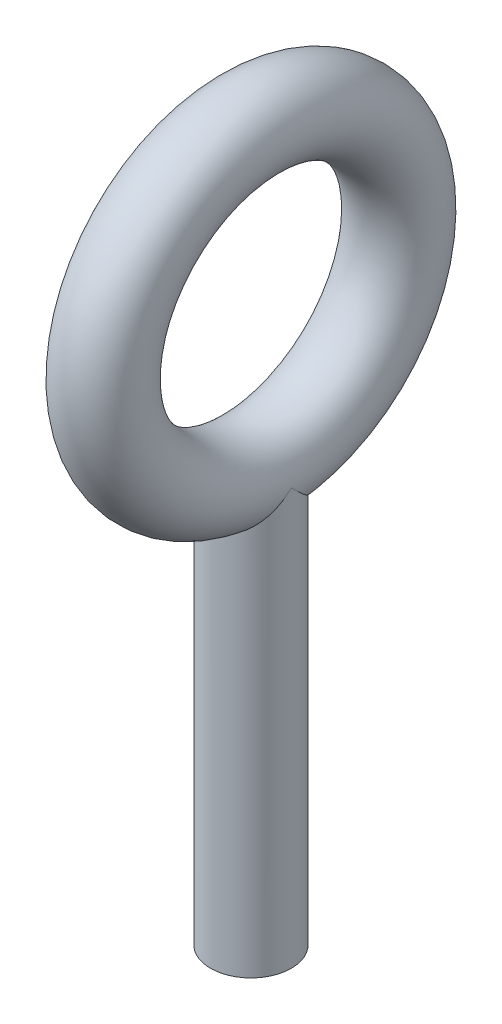
ISO-10303-21;
HEADER;
FILE_DESCRIPTION(('STEP AP214'),'2;1');
FILE_NAME('part.step','',(''),(''),'','','');
FILE_SCHEMA(('AUTOMOTIVE_DESIGN { 1 0 10303 214 1 1 1 1 }'));
ENDSEC;
DATA;
#1=APPLICATION_CONTEXT('core data for automotive mechanical design processes');
#2=APPLICATION_PROTOCOL_DEFINITION('international standard','automotive_design',2000,#1);
#3=PRODUCT_CONTEXT('',#1,'mechanical');
#4=PRODUCT('Part','Part','',(#3));
#5=PRODUCT_RELATED_PRODUCT_CATEGORY('part','',(#4));
#6=PRODUCT_DEFINITION_FORMATION('','',#4);
#7=PRODUCT_DEFINITION_CONTEXT('part definition',#1,'design');
#8=PRODUCT_DEFINITION('design','',#6,#7);
#9=PRODUCT_DEFINITION_SHAPE('','',#8);
#10=(LENGTH_UNIT() NAMED_UNIT(*) SI_UNIT(.MILLI.,.METRE.));
#11=(NAMED_UNIT(*) PLANE_ANGLE_UNIT() SI_UNIT($,.RADIAN.));
#12=(NAMED_UNIT(*) SI_UNIT($,.STERADIAN.) SOLID_ANGLE_UNIT());
#13=UNCERTAINTY_MEASURE_WITH_UNIT(LENGTH_MEASURE(1.E-05),#10,'distance_accuracy_value','');
#14=(GEOMETRIC_REPRESENTATION_CONTEXT(3) GLOBAL_UNCERTAINTY_ASSIGNED_CONTEXT((#13)) GLOBAL_UNIT_ASSIGNED_CONTEXT((#10,
#11,#12)) REPRESENTATION_CONTEXT('',''));
#15=CARTESIAN_POINT('',(0.,0.,0.));
#16=DIRECTION('',(0.,0.,1.));
#17=DIRECTION('',(1.,0.,0.));
#18=AXIS2_PLACEMENT_3D('',#15,#16,#17);
#19=CARTESIAN_POINT('',(0.,-6.1468,0.));
#20=DIRECTION('',(0.,1.,0.));
#21=DIRECTION('',(-1.,0.,0.));
#22=AXIS2_PLACEMENT_3D('',#19,#20,#21);
#23=PLANE('',#22);
#24=CARTESIAN_POINT('',(0.,-6.1468,0.));
#25=DIRECTION('',(0.,1.,0.));
#26=DIRECTION('',(-1.,0.,0.));
#27=AXIS2_PLACEMENT_3D('',#24,#25,#26);
#28=CIRCLE('',#27,0.5969);
#29=CARTESIAN_POINT('',(-0.596899999999999,-6.1468,0.));
#30=VERTEX_POINT('',#29);
#31=EDGE_CURVE('E58',#30,#30,#28,.T.);
#32=ORIENTED_EDGE('',*,*,#31,.F.);
#33=EDGE_LOOP('',(#32));
#34=FACE_BOUND('',#33,.T.);
#35=ADVANCED_FACE('F36',(#34),#23,.F.);
#36=CARTESIAN_POINT('',(0.,0.,0.));
#37=DIRECTION('',(0.,1.,0.));
#38=DIRECTION('',(-1.,0.,0.));
#39=AXIS2_PLACEMENT_3D('',#36,#37,#38);
#40=CYLINDRICAL_SURFACE('',#39,0.5969);
#41=ORIENTED_EDGE('',*,*,#31,.T.);
#42=EDGE_LOOP('',(#41));
#43=FACE_BOUND('',#42,.T.);
#44=CARTESIAN_POINT('',(-0.596900000000008,0.,0.));
#45=CARTESIAN_POINT('',(-0.59689999672191,-0.00115166970639385,-0.00115166395822712));
#46=CARTESIAN_POINT('',(-0.596896663850171,-0.00230293210871517,-0.00230383750789253));
#47=CARTESIAN_POINT('',(-0.596683975074274,-0.0389902069788766,-0.0390492907996926));
#48=CARTESIAN_POINT('',(-0.593294296523942,-0.0741274953254708,-0.0751142793313067));
#49=CARTESIAN_POINT('',(-0.579584038373088,-0.142996451439127,-0.147405062306423));
#50=CARTESIAN_POINT('',(-0.569251658724919,-0.176725622084085,-0.183631026042319));
#51=CARTESIAN_POINT('',(-0.542629910612611,-0.238196290566407,-0.250992645636391));
#52=CARTESIAN_POINT('',(-0.52716990452444,-0.266178648269077,-0.282231590514672));
#53=CARTESIAN_POINT('',(-0.489850016558436,-0.319699822107093,-0.34293153130478));
#54=CARTESIAN_POINT('',(-0.467999843013148,-0.345242267579701,-0.372395143112474));
#55=CARTESIAN_POINT('',(-0.422967037142856,-0.387859170793755,-0.422212059964091));
#56=CARTESIAN_POINT('',(-0.401063884762186,-0.40557748576254,-0.443167716610892));
#57=CARTESIAN_POINT('',(-0.353100226478506,-0.43833093396657,-0.48224837340783));
#58=CARTESIAN_POINT('',(-0.327044413154196,-0.453369055712043,-0.500376523474592));
#59=CARTESIAN_POINT('',(-0.275758103179163,-0.477834094144657,-0.530068366450765));
#60=CARTESIAN_POINT('',(-0.25111843235949,-0.487778830974002,-0.542222874781559));
#61=CARTESIAN_POINT('',(-0.199563337685278,-0.504903324176813,-0.563238288474522));
#62=CARTESIAN_POINT('',(-0.172648955762118,-0.512084338191715,-0.572100691856146));
#63=CARTESIAN_POINT('',(-0.117054366971276,-0.523332478977347,-0.586014346634592));
#64=CARTESIAN_POINT('',(-0.0883654858306846,-0.527382746382812,-0.591044961400426));
#65=CARTESIAN_POINT('',(-0.0302854841852904,-0.532050188002906,-0.596844085703701));
#66=CARTESIAN_POINT('',(-0.000894642224942459,-0.532668701963456,-0.597614258504143));
#67=CARTESIAN_POINT('',(0.0548076303898074,-0.53054237850848,-0.594970756146327));
#68=CARTESIAN_POINT('',(0.0811505878990104,-0.528105874154994,-0.591940625835263));
#69=CARTESIAN_POINT('',(0.132818571562041,-0.520514831812041,-0.582527610778966));
#70=CARTESIAN_POINT('',(0.158143596866914,-0.515360291555784,-0.576144723237598));
#71=CARTESIAN_POINT('',(0.207506606196205,-0.502492465874494,-0.560278836043188));
#72=CARTESIAN_POINT('',(0.231522373486923,-0.49474529958647,-0.550754812715354));
#73=CARTESIAN_POINT('',(0.277460170251825,-0.477034110025979,-0.529104071902027));
#74=CARTESIAN_POINT('',(0.299381558002946,-0.467069410389621,-0.51697656037355));
#75=CARTESIAN_POINT('',(0.343528231705452,-0.443862500951751,-0.488923664721468));
#76=CARTESIAN_POINT('',(0.365435284639527,-0.430364310979961,-0.472711117113507));
#77=CARTESIAN_POINT('',(0.406124999135573,-0.401416594123904,-0.43825165407306));
#78=CARTESIAN_POINT('',(0.42490541315061,-0.385965677460319,-0.420003290821415));
#79=CARTESIAN_POINT('',(0.468174189097679,-0.345163764794427,-0.372296644811044));
#80=CARTESIAN_POINT('',(0.490659727748239,-0.318795221667218,-0.341883754321856));
#81=CARTESIAN_POINT('',(0.528864325309235,-0.263473679698126,-0.279187227434826));
#82=CARTESIAN_POINT('',(0.544568075898522,-0.234515010126415,-0.246899543421829));
#83=CARTESIAN_POINT('',(0.570563921531062,-0.172705185450035,-0.179298854105692));
#84=CARTESIAN_POINT('',(0.580399017763528,-0.139723480827757,-0.143932529247574));
#85=CARTESIAN_POINT('',(0.593455159625093,-0.0724376676477142,-0.0733801876493672));
#86=CARTESIAN_POINT('',(0.596688918821215,-0.0381362308950352,-0.0381939547501493));
#87=CARTESIAN_POINT('',(0.596896664078754,-0.0023029330153976,-0.00230383860594077));
#88=CARTESIAN_POINT('',(0.596899996965183,-0.0011516706078514,-0.00115166505575185));
#89=CARTESIAN_POINT('',(0.596900000000008,0.,0.));
#90=B_SPLINE_CURVE_WITH_KNOTS('',3,(#44,#45,#46,#47,#48,#49,#50,#51,#52,#53,#54,#55,#56,#57,#58,
#59,#60,#61,#62,#63,#64,#65,#66,#67,#68,#69,#70,#71,#72,#73,#74,#75,#76,#77,#78,#79,#80,#81,#82,
#83,#84,#85,#86,#87,#88,#89),.UNSPECIFIED.,.F.,.F.,(4,2,2,2,2,2,2,2,2,2,2,2,2,2,2,2,2,2,2,2,2,2,
4),(0.,0.00488631802969902,0.155768918788364,0.306908615530458,0.440528425998742,
0.573946278417264,0.67889168520902,0.783719331914838,0.871014392918477,0.958269682907401,
1.0459916391098,1.13367934652114,1.21318804583536,1.29269681145844,1.37328805721572,
1.45390391766483,1.54480775842434,1.63577666478513,1.77333590749237,1.91120405575853,
2.05874533227616,2.20600218878239,2.2108885068121),.UNSPECIFIED.);
#91=CARTESIAN_POINT('',(-0.596900000000008,0.,0.));
#92=VERTEX_POINT('',#91);
#93=CARTESIAN_POINT('',(0.5969,0.,0.));
#94=VERTEX_POINT('',#93);
#95=EDGE_CURVE('E50',#92,#94,#90,.T.);
#96=ORIENTED_EDGE('',*,*,#95,.T.);
#97=CARTESIAN_POINT('',(0.596900000000008,0.,0.));
#98=CARTESIAN_POINT('',(0.59689999672191,-0.00115166970639353,0.00115166395822713));
#99=CARTESIAN_POINT('',(0.596896663850171,-0.00230293210871485,0.00230383750789254));
#100=CARTESIAN_POINT('',(0.596683975074274,-0.0389902069788762,0.0390492907996928));
#101=CARTESIAN_POINT('',(0.593294296523942,-0.0741274953254705,0.075114279331307));
#102=CARTESIAN_POINT('',(0.579584038373088,-0.142996451439127,0.147405062306423));
#103=CARTESIAN_POINT('',(0.569251658724919,-0.176725622084085,0.183631026042319));
#104=CARTESIAN_POINT('',(0.542629910612611,-0.238196290566408,0.250992645636391));
#105=CARTESIAN_POINT('',(0.527169904524439,-0.266178648269077,0.282231590514673));
#106=CARTESIAN_POINT('',(0.489850016558435,-0.319699822107094,0.342931531304781));
#107=CARTESIAN_POINT('',(0.467999843013147,-0.345242267579703,0.372395143112475));
#108=CARTESIAN_POINT('',(0.422967037142855,-0.387859170793756,0.422212059964092));
#109=CARTESIAN_POINT('',(0.401063884762185,-0.40557748576254,0.443167716610893));
#110=CARTESIAN_POINT('',(0.353100226478505,-0.43833093396657,0.482248373407831));
#111=CARTESIAN_POINT('',(0.327044413154196,-0.453369055712044,0.500376523474592));
#112=CARTESIAN_POINT('',(0.275758103179163,-0.477834094144658,0.530068366450765));
#113=CARTESIAN_POINT('',(0.25111843235949,-0.487778830974003,0.54222287478156));
#114=CARTESIAN_POINT('',(0.199563337685278,-0.504903324176814,0.563238288474522));
#115=CARTESIAN_POINT('',(0.172648955762118,-0.512084338191715,0.572100691856147));
#116=CARTESIAN_POINT('',(0.117054366971276,-0.523332478977347,0.586014346634592));
#117=CARTESIAN_POINT('',(0.088365485830684,-0.527382746382813,0.591044961400426));
#118=CARTESIAN_POINT('',(0.0302854841852899,-0.532050188002907,0.596844085703701));
#119=CARTESIAN_POINT('',(0.000894642224941971,-0.532668701963456,0.597614258504143));
#120=CARTESIAN_POINT('',(-0.0548076303898079,-0.530542378508479,0.594970756146327));
#121=CARTESIAN_POINT('',(-0.081150587899011,-0.528105874154993,0.591940625835263));
#122=CARTESIAN_POINT('',(-0.132818571562042,-0.520514831812041,0.582527610778966));
#123=CARTESIAN_POINT('',(-0.158143596866915,-0.515360291555784,0.576144723237597));
#124=CARTESIAN_POINT('',(-0.207506606196206,-0.502492465874494,0.560278836043188));
#125=CARTESIAN_POINT('',(-0.231522373486923,-0.49474529958647,0.550754812715354));
#126=CARTESIAN_POINT('',(-0.277460170251825,-0.477034110025978,0.529104071902027));
#127=CARTESIAN_POINT('',(-0.299381558002946,-0.46706941038962,0.51697656037355));
#128=CARTESIAN_POINT('',(-0.343528231705452,-0.443862500951751,0.488923664721467));
#129=CARTESIAN_POINT('',(-0.365435284639528,-0.43036431097996,0.472711117113507));
#130=CARTESIAN_POINT('',(-0.406124999135574,-0.401416594123903,0.43825165407306));
#131=CARTESIAN_POINT('',(-0.42490541315061,-0.385965677460319,0.420003290821414));
#132=CARTESIAN_POINT('',(-0.468174189097679,-0.345163764794426,0.372296644811044));
#133=CARTESIAN_POINT('',(-0.490659727748239,-0.318795221667217,0.341883754321857));
#134=CARTESIAN_POINT('',(-0.528864325309235,-0.263473679698126,0.279187227434824));
#135=CARTESIAN_POINT('',(-0.544568075898522,-0.234515010126417,0.246899543421826));
#136=CARTESIAN_POINT('',(-0.570563921531062,-0.172705185450032,0.179298854105694));
#137=CARTESIAN_POINT('',(-0.580399017763528,-0.139723480827746,0.143932529247583));
#138=CARTESIAN_POINT('',(-0.593455159625093,-0.0724376676477228,0.0733801876493581));
#139=CARTESIAN_POINT('',(-0.596688918821215,-0.03813623089507,0.0381939547501146));
#140=CARTESIAN_POINT('',(-0.596896664078754,-0.00230293301540027,0.00230383860593859));
#141=CARTESIAN_POINT('',(-0.596899996965183,-0.00115167060785292,0.00115166505575072));
#142=CARTESIAN_POINT('',(-0.596900000000008,0.,0.));
#143=B_SPLINE_CURVE_WITH_KNOTS('',3,(#97,#98,#99,#100,#101,#102,#103,#104,#105,#106,#107,#108,
#109,#110,#111,#112,#113,#114,#115,#116,#117,#118,#119,#120,#121,#122,#123,#124,#125,#126,#127,
#128,#129,#130,#131,#132,#133,#134,#135,#136,#137,#138,#139,#140,#141,#142),.UNSPECIFIED.,.F.,
.F.,(4,2,2,2,2,2,2,2,2,2,2,2,2,2,2,2,2,2,2,2,2,2,4),(0.,0.00488631802969902,0.155768918788364,
0.306908615530459,0.440528425998743,0.573946278417266,0.678891685209021,0.783719331914839,
0.871014392918477,0.958269682907401,1.0459916391098,1.13367934652114,1.21318804583536,
1.29269681145844,1.37328805721572,1.45390391766483,1.54480775842434,1.63577666478514,
1.77333590749237,1.91120405575853,2.05874533227616,2.20600218878239,2.2108885068121),.UNSPECIFIED.);
#144=EDGE_CURVE('E11',#94,#92,#143,.T.);
#145=ORIENTED_EDGE('',*,*,#144,.T.);
#146=EDGE_LOOP('',(#96,#145));
#147=FACE_BOUND('',#146,.T.);
#148=ADVANCED_FACE('F57',(#43,#147),#40,.T.);
#149=CARTESIAN_POINT('',(0.,2.1844,0.));
#150=DIRECTION('',(-1.,0.,0.));
#151=DIRECTION('',(0.,0.,1.));
#152=AXIS2_PLACEMENT_3D('',#149,#150,#151);
#153=TOROIDAL_SURFACE('',#152,2.1844,0.5969);
#154=ORIENTED_EDGE('',*,*,#144,.F.);
#155=ORIENTED_EDGE('',*,*,#95,.F.);
#156=EDGE_LOOP('',(#154,#155));
#157=FACE_BOUND('',#156,.T.);
#158=ADVANCED_FACE('F38',(#157),#153,.T.);
#159=CLOSED_SHELL('',(#35,#148,#158));
#160=MANIFOLD_SOLID_BREP('B2',#159);
#161=ADVANCED_BREP_SHAPE_REPRESENTATION('',(#18,#160),#14);
#162=SHAPE_DEFINITION_REPRESENTATION(#9,#161);
ENDSEC;
END-ISO-10303-21;
